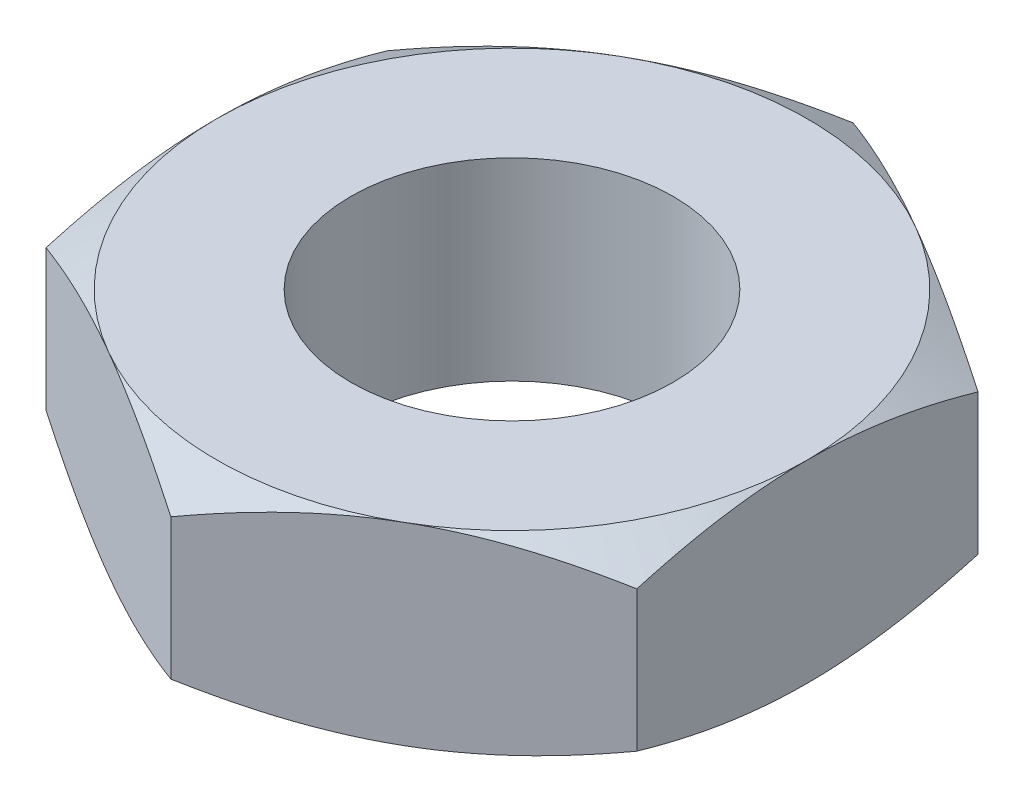
ISO-10303-21;
HEADER;
FILE_DESCRIPTION(('STEP AP214'),'2;1');
FILE_NAME('part.step','',(''),(''),'','','');
FILE_SCHEMA(('AUTOMOTIVE_DESIGN { 1 0 10303 214 1 1 1 1 }'));
ENDSEC;
DATA;
#1=APPLICATION_CONTEXT('core data for automotive mechanical design processes');
#2=APPLICATION_PROTOCOL_DEFINITION('international standard','automotive_design',2000,#1);
#3=PRODUCT_CONTEXT('',#1,'mechanical');
#4=PRODUCT('Part','Part','',(#3));
#5=PRODUCT_RELATED_PRODUCT_CATEGORY('part','',(#4));
#6=PRODUCT_DEFINITION_FORMATION('','',#4);
#7=PRODUCT_DEFINITION_CONTEXT('part definition',#1,'design');
#8=PRODUCT_DEFINITION('design','',#6,#7);
#9=PRODUCT_DEFINITION_SHAPE('','',#8);
#10=(LENGTH_UNIT() NAMED_UNIT(*) SI_UNIT(.MILLI.,.METRE.));
#11=(NAMED_UNIT(*) PLANE_ANGLE_UNIT() SI_UNIT($,.RADIAN.));
#12=(NAMED_UNIT(*) SI_UNIT($,.STERADIAN.) SOLID_ANGLE_UNIT());
#13=UNCERTAINTY_MEASURE_WITH_UNIT(LENGTH_MEASURE(1.E-05),#10,'distance_accuracy_value','');
#14=(GEOMETRIC_REPRESENTATION_CONTEXT(3) GLOBAL_UNCERTAINTY_ASSIGNED_CONTEXT((#13)) GLOBAL_UNIT_ASSIGNED_CONTEXT((#10,
#11,#12)) REPRESENTATION_CONTEXT('',''));
#15=CARTESIAN_POINT('',(0.,0.,0.));
#16=DIRECTION('',(0.,0.,1.));
#17=DIRECTION('',(1.,0.,0.));
#18=AXIS2_PLACEMENT_3D('',#15,#16,#17);
#19=CARTESIAN_POINT('',(-2.75,0.9,-1.58771324027147));
#20=DIRECTION('',(0.,1.,0.));
#21=DIRECTION('',(0.,0.,1.));
#22=AXIS2_PLACEMENT_3D('',#19,#20,#21);
#23=PLANE('',#22);
#24=CARTESIAN_POINT('',(0.,0.9,0.));
#25=DIRECTION('',(0.,1.,0.));
#26=DIRECTION('',(0.,0.,1.));
#27=AXIS2_PLACEMENT_3D('',#24,#25,#26);
#28=CIRCLE('',#27,1.5);
#29=CARTESIAN_POINT('',(0.,0.9,1.5));
#30=VERTEX_POINT('',#29);
#31=EDGE_CURVE('E233',#30,#30,#28,.T.);
#32=ORIENTED_EDGE('',*,*,#31,.F.);
#33=EDGE_LOOP('',(#32));
#34=FACE_BOUND('',#33,.T.);
#35=CARTESIAN_POINT('',(0.,0.9,0.));
#36=DIRECTION('',(0.,1.,0.));
#37=DIRECTION('',(0.,0.,1.));
#38=AXIS2_PLACEMENT_3D('',#35,#36,#37);
#39=CIRCLE('',#38,2.75);
#40=CARTESIAN_POINT('',(-1.375,0.9,2.38156986040721));
#41=VERTEX_POINT('',#40);
#42=CARTESIAN_POINT('',(1.375,0.9,2.3815698604072));
#43=VERTEX_POINT('',#42);
#44=EDGE_CURVE('E288',#41,#43,#39,.T.);
#45=ORIENTED_EDGE('',*,*,#44,.T.);
#46=CARTESIAN_POINT('',(2.75,0.9,0.));
#47=VERTEX_POINT('',#46);
#48=EDGE_CURVE('E291',#43,#47,#39,.T.);
#49=ORIENTED_EDGE('',*,*,#48,.T.);
#50=CARTESIAN_POINT('',(1.375,0.9,-2.38156986040721));
#51=VERTEX_POINT('',#50);
#52=EDGE_CURVE('E298',#47,#51,#39,.T.);
#53=ORIENTED_EDGE('',*,*,#52,.T.);
#54=CARTESIAN_POINT('',(-1.375,0.9,-2.38156986040721));
#55=VERTEX_POINT('',#54);
#56=EDGE_CURVE('E302',#51,#55,#39,.T.);
#57=ORIENTED_EDGE('',*,*,#56,.T.);
#58=CARTESIAN_POINT('',(-2.75,0.9,0.));
#59=VERTEX_POINT('',#58);
#60=EDGE_CURVE('E295',#55,#59,#39,.T.);
#61=ORIENTED_EDGE('',*,*,#60,.T.);
#62=EDGE_CURVE('E290',#59,#41,#39,.T.);
#63=ORIENTED_EDGE('',*,*,#62,.T.);
#64=EDGE_LOOP('',(#45,#49,#53,#57,#61,#63));
#65=FACE_BOUND('',#64,.T.);
#66=ADVANCED_FACE('F35',(#34,#65),#23,.T.);
#67=CARTESIAN_POINT('',(0.,0.9,-3.17542648054294));
#68=DIRECTION('',(0.5,0.,0.866025403784439));
#69=DIRECTION('',(0.866025403784439,0.,-0.5));
#70=AXIS2_PLACEMENT_3D('',#67,#68,#69);
#71=PLANE('',#70);
#72=DIRECTION('',(0.,-1.,0.));
#73=VECTOR('',#72,1.);
#74=CARTESIAN_POINT('',(0.,0.9,-3.17542648054294));
#75=LINE('',#74,#73);
#76=CARTESIAN_POINT('',(0.,0.654379906938139,-3.17542648054294));
#77=VERTEX_POINT('',#76);
#78=CARTESIAN_POINT('',(0.,-0.654379906938139,-3.17542648054294));
#79=VERTEX_POINT('',#78);
#80=EDGE_CURVE('E230',#77,#79,#75,.T.);
#81=ORIENTED_EDGE('',*,*,#80,.T.);
#82=CARTESIAN_POINT('',(0.000199999999999998,-0.654313236635241,-3.17554195059678));
#83=CARTESIAN_POINT('',(-0.120649220659906,-0.694612337750738,-3.10576962051743));
#84=CARTESIAN_POINT('',(-0.242541602622634,-0.731263097402339,-3.03539502097908));
#85=CARTESIAN_POINT('',(-0.488437126727893,-0.7952378170302,-2.89342717394439));
#86=CARTESIAN_POINT('',(-0.612444638573855,-0.822539144325503,-2.82183140359858));
#87=CARTESIAN_POINT('',(-0.858922797975944,-0.865038254705884,-2.67952717191842));
#88=CARTESIAN_POINT('',(-0.981355518587417,-0.880518881377543,-2.60884060771577));
#89=CARTESIAN_POINT('',(-1.22679714236892,-0.89900060263006,-2.46713482015518));
#90=CARTESIAN_POINT('',(-1.34980515323291,-0.902017000537401,-2.39611611197038));
#91=CARTESIAN_POINT('',(-1.57965878661079,-0.895746854571454,-2.26341005486544));
#92=CARTESIAN_POINT('',(-1.68653879125402,-0.887999845723298,-2.20170285541369));
#93=CARTESIAN_POINT('',(-1.89960246733475,-0.863444818935646,-2.07869048467395));
#94=CARTESIAN_POINT('',(-2.00578540164889,-0.84662841034943,-2.01738573896433));
#95=CARTESIAN_POINT('',(-2.21928848939318,-0.804588077654045,-1.89411967378235));
#96=CARTESIAN_POINT('',(-2.32658161614285,-0.77918591931277,-1.83217395817123));
#97=CARTESIAN_POINT('',(-2.53956747928405,-0.721532774160019,-1.70920651275307));
#98=CARTESIAN_POINT('',(-2.64526294502665,-0.689295336701019,-1.64818320715446));
#99=CARTESIAN_POINT('',(-2.7502,-0.654313236635241,-1.58759777021763));
#100=B_SPLINE_CURVE_WITH_KNOTS('',3,(#82,#83,#84,#85,#86,#87,#88,#89,#90,#91,#92,#93,#94,#95,
#96,#97,#98,#99),.UNSPECIFIED.,.F.,.F.,(4,2,2,2,2,2,2,2,4),(0.,0.435912828725888,
0.872873557116332,1.29901931904672,1.72464171213574,2.09526089052938,2.46622354066374,
2.84541551798557,3.22386274754524),.UNSPECIFIED.);
#101=CARTESIAN_POINT('',(-1.375,-0.9,-2.38156986040721));
#102=VERTEX_POINT('',#101);
#103=EDGE_CURVE('E58',#79,#102,#100,.T.);
#104=ORIENTED_EDGE('',*,*,#103,.T.);
#105=CARTESIAN_POINT('',(-2.75,-0.654379906938285,-1.58771324027169));
#106=VERTEX_POINT('',#105);
#107=EDGE_CURVE('E191',#102,#106,#100,.T.);
#108=ORIENTED_EDGE('',*,*,#107,.T.);
#109=DIRECTION('',(0.,-1.,0.));
#110=VECTOR('',#109,1.);
#111=CARTESIAN_POINT('',(-2.75,0.9,-1.58771324027147));
#112=LINE('',#111,#110);
#113=CARTESIAN_POINT('',(-2.75,0.654379906938285,-1.58771324027169));
#114=VERTEX_POINT('',#113);
#115=EDGE_CURVE('E218',#114,#106,#112,.T.);
#116=ORIENTED_EDGE('',*,*,#115,.F.);
#117=CARTESIAN_POINT('',(0.000199999999999998,0.654313236635241,-3.17554195059678));
#118=CARTESIAN_POINT('',(-0.120649220659906,0.694612337750738,-3.10576962051743));
#119=CARTESIAN_POINT('',(-0.242541602622634,0.731263097402339,-3.03539502097908));
#120=CARTESIAN_POINT('',(-0.488437126727893,0.7952378170302,-2.89342717394439));
#121=CARTESIAN_POINT('',(-0.612444638573855,0.822539144325503,-2.82183140359858));
#122=CARTESIAN_POINT('',(-0.858922797975944,0.865038254705884,-2.67952717191842));
#123=CARTESIAN_POINT('',(-0.981355518587417,0.880518881377543,-2.60884060771577));
#124=CARTESIAN_POINT('',(-1.22679714236892,0.89900060263006,-2.46713482015518));
#125=CARTESIAN_POINT('',(-1.34980515323291,0.902017000537401,-2.39611611197038));
#126=CARTESIAN_POINT('',(-1.57965878661079,0.895746854571454,-2.26341005486544));
#127=CARTESIAN_POINT('',(-1.68653879125402,0.887999845723298,-2.20170285541369));
#128=CARTESIAN_POINT('',(-1.89960246733475,0.863444818935646,-2.07869048467395));
#129=CARTESIAN_POINT('',(-2.00578540164889,0.84662841034943,-2.01738573896433));
#130=CARTESIAN_POINT('',(-2.21928848939318,0.804588077654045,-1.89411967378235));
#131=CARTESIAN_POINT('',(-2.32658161614285,0.77918591931277,-1.83217395817123));
#132=CARTESIAN_POINT('',(-2.53956747928405,0.721532774160019,-1.70920651275307));
#133=CARTESIAN_POINT('',(-2.64526294502665,0.689295336701019,-1.64818320715446));
#134=CARTESIAN_POINT('',(-2.7502,0.654313236635241,-1.58759777021763));
#135=B_SPLINE_CURVE_WITH_KNOTS('',3,(#117,#118,#119,#120,#121,#122,#123,#124,#125,#126,#127,
#128,#129,#130,#131,#132,#133,#134),.UNSPECIFIED.,.F.,.F.,(4,2,2,2,2,2,2,2,4),(0.,
0.435912828725888,0.872873557116332,1.29901931904672,1.72464171213574,2.09526089052938,
2.46622354066374,2.84541551798557,3.22386274754524),.UNSPECIFIED.);
#136=EDGE_CURVE('E240',#55,#114,#135,.T.);
#137=ORIENTED_EDGE('',*,*,#136,.F.);
#138=EDGE_CURVE('E237',#77,#55,#135,.T.);
#139=ORIENTED_EDGE('',*,*,#138,.F.);
#140=EDGE_LOOP('',(#81,#104,#108,#116,#137,#139));
#141=FACE_BOUND('',#140,.T.);
#142=ADVANCED_FACE('F37',(#141),#71,.F.);
#143=CARTESIAN_POINT('',(-2.75,0.9,-1.58771324027147));
#144=DIRECTION('',(1.,0.,0.));
#145=DIRECTION('',(0.,0.,-1.));
#146=AXIS2_PLACEMENT_3D('',#143,#144,#145);
#147=PLANE('',#146);
#148=ORIENTED_EDGE('',*,*,#115,.T.);
#149=CARTESIAN_POINT('',(-2.75,0.460292801968697,-4.30229228147667));
#150=CARTESIAN_POINT('',(-2.75,0.401715698769004,-4.18184588321156));
#151=CARTESIAN_POINT('',(-2.75,0.343689570601256,-4.06112695427671));
#152=CARTESIAN_POINT('',(-2.75,0.229048462854545,-3.81899921535963));
#153=CARTESIAN_POINT('',(-2.75,0.172433698649216,-3.69759030351562));
#154=CARTESIAN_POINT('',(-2.75,0.0606477565982202,-3.4533302493796));
#155=CARTESIAN_POINT('',(-2.75,0.00548579337230973,-3.33047487569264));
#156=CARTESIAN_POINT('',(-2.75,-0.10262979006472,-3.08379982818744));
#157=CARTESIAN_POINT('',(-2.75,-0.155583512232009,-2.95998019920355));
#158=CARTESIAN_POINT('',(-2.75,-0.26040203140135,-2.7070748972286));
#159=CARTESIAN_POINT('',(-2.75,-0.312173286945629,-2.57795024654349));
#160=CARTESIAN_POINT('',(-2.75,-0.411887571928489,-2.3182042596449));
#161=CARTESIAN_POINT('',(-2.75,-0.459830177176171,-2.18758275941794));
#162=CARTESIAN_POINT('',(-2.75,-0.550656251359419,-1.92486771315457));
#163=CARTESIAN_POINT('',(-2.75,-0.593549636883523,-1.79277762963402));
#164=CARTESIAN_POINT('',(-2.75,-0.67292585979378,-1.5267030839741));
#165=CARTESIAN_POINT('',(-2.75,-0.709410676239576,-1.39271922052041));
#166=CARTESIAN_POINT('',(-2.75,-0.774051978112354,-1.12351502376349));
#167=CARTESIAN_POINT('',(-2.75,-0.802253962773325,-0.988305818065019));
#168=CARTESIAN_POINT('',(-2.75,-0.848756307085882,-0.716167543492841));
#169=CARTESIAN_POINT('',(-2.75,-0.867057700372022,-0.579238655684047));
#170=CARTESIAN_POINT('',(-2.75,-0.89206096141632,-0.306149321740134));
#171=CARTESIAN_POINT('',(-2.75,-0.898914934605899,-0.17000315446768));
#172=CARTESIAN_POINT('',(-2.75,-0.900845103918733,0.102386201711707));
#173=CARTESIAN_POINT('',(-2.75,-0.895921067219212,0.238629392483338));
#174=CARTESIAN_POINT('',(-2.75,-0.878005096328899,0.468799581618867));
#175=CARTESIAN_POINT('',(-2.75,-0.867929416421033,0.562968248554006));
#176=CARTESIAN_POINT('',(-2.75,-0.842758272239521,0.750636766805154));
#177=CARTESIAN_POINT('',(-2.75,-0.827662158780661,0.844136530028113));
#178=CARTESIAN_POINT('',(-2.75,-0.775634520462128,1.12349388265861));
#179=CARTESIAN_POINT('',(-2.75,-0.731972226995504,1.30811301992888));
#180=CARTESIAN_POINT('',(-2.75,-0.655985008360692,1.58428098783429));
#181=CARTESIAN_POINT('',(-2.75,-0.628535830793461,1.6772530181262));
#182=CARTESIAN_POINT('',(-2.75,-0.570719976824478,1.86229424858384));
#183=CARTESIAN_POINT('',(-2.75,-0.540353278769842,1.95436344204342));
#184=CARTESIAN_POINT('',(-2.75,-0.477195289852816,2.13762784914898));
#185=CARTESIAN_POINT('',(-2.75,-0.444404727800364,2.22882331626663));
#186=CARTESIAN_POINT('',(-2.75,-0.37679149018024,2.41045326785417));
#187=CARTESIAN_POINT('',(-2.75,-0.341968855720013,2.5008877676756));
#188=CARTESIAN_POINT('',(-2.75,-0.248080054227535,2.73803868889508));
#189=CARTESIAN_POINT('',(-2.75,-0.187603508593744,2.88419612668514));
#190=CARTESIAN_POINT('',(-2.75,-0.0632546405263525,3.17506436878796));
#191=CARTESIAN_POINT('',(-2.75,0.000618015250890259,3.31977502943065));
#192=CARTESIAN_POINT('',(-2.75,0.130975986203147,3.60806551523662));
#193=CARTESIAN_POINT('',(-2.75,0.197462111256228,3.75164497304352));
#194=CARTESIAN_POINT('',(-2.75,0.332451238107801,4.03785436433045));
#195=CARTESIAN_POINT('',(-2.75,0.400954297186409,4.18048427070228));
#196=CARTESIAN_POINT('',(-2.75,0.609019028849832,4.60763641251465));
#197=CARTESIAN_POINT('',(-2.75,0.750945116080421,4.89100559224824));
#198=CARTESIAN_POINT('',(-2.75,1.03880084166866,5.45562064142955));
#199=CARTESIAN_POINT('',(-2.75,1.18472972560453,5.73686689842236));
#200=CARTESIAN_POINT('',(-2.75,1.46444275775998,6.26953449084933));
#201=CARTESIAN_POINT('',(-2.75,1.59796226335303,6.5210950380334));
#202=CARTESIAN_POINT('',(-2.75,1.8666383903487,7.02335674412299));
#203=CARTESIAN_POINT('',(-2.75,2.00179510165774,7.27405785485413));
#204=CARTESIAN_POINT('',(-2.75,2.27290177486606,7.77401000381799));
#205=CARTESIAN_POINT('',(-2.75,2.40884790427718,8.02326312277004));
#206=CARTESIAN_POINT('',(-2.75,2.68167969506653,8.5212312678429));
#207=CARTESIAN_POINT('',(-2.75,2.8185652873858,8.76994633178476));
#208=CARTESIAN_POINT('',(-2.75,2.95579397189845,9.01847061905945));
#209=B_SPLINE_CURVE_WITH_KNOTS('',3,(#149,#150,#151,#152,#153,#154,#155,#156,#157,#158,#159,
#160,#161,#162,#163,#164,#165,#166,#167,#168,#169,#170,#171,#172,#173,#174,#175,#176,#177,#178,
#179,#180,#181,#182,#183,#184,#185,#186,#187,#188,#189,#190,#191,#192,#193,#194,#195,#196,#197,
#198,#199,#200,#201,#202,#203,#204,#205,#206,#207,#208),.UNSPECIFIED.,.F.,.F.,(4,2,2,2,2,2,2,2,
2,2,2,2,2,2,2,2,2,2,2,2,2,2,2,2,2,2,2,2,2,4),(0.,0.401810043563882,0.803681032443233,
1.20767668606413,1.61165366619977,2.0289566266266,2.44630575769423,2.8628210405234,
3.27920747034625,3.69326188673398,4.10727306695812,4.51573806307525,4.92421113362441,
5.20819264013989,5.49221088219265,6.06053671535663,6.35132938133471,6.64212420564753,
6.93283194637515,7.22353380831987,7.69799655406946,8.17250595677581,8.64716358088236,
9.12183469810138,10.0725485843152,11.0230845007839,11.8774716760369,12.7319059842119,
13.5836526407181,14.4353373428422),.UNSPECIFIED.);
#210=CARTESIAN_POINT('',(-2.75,-0.9,0.));
#211=VERTEX_POINT('',#210);
#212=EDGE_CURVE('E269',#106,#211,#209,.T.);
#213=ORIENTED_EDGE('',*,*,#212,.T.);
#214=CARTESIAN_POINT('',(-2.75,-0.654379906938139,1.58771324027147));
#215=VERTEX_POINT('',#214);
#216=EDGE_CURVE('E264',#211,#215,#209,.T.);
#217=ORIENTED_EDGE('',*,*,#216,.T.);
#218=DIRECTION('',(0.,-1.,0.));
#219=VECTOR('',#218,1.);
#220=CARTESIAN_POINT('',(-2.75,0.9,1.58771324027147));
#221=LINE('',#220,#219);
#222=CARTESIAN_POINT('',(-2.75,0.654379906938139,1.58771324027147));
#223=VERTEX_POINT('',#222);
#224=EDGE_CURVE('E221',#223,#215,#221,.T.);
#225=ORIENTED_EDGE('',*,*,#224,.F.);
#226=CARTESIAN_POINT('',(-2.75,-0.460292801968697,-4.30229228147667));
#227=CARTESIAN_POINT('',(-2.75,-0.401715698769004,-4.18184588321156));
#228=CARTESIAN_POINT('',(-2.75,-0.343689570601256,-4.06112695427671));
#229=CARTESIAN_POINT('',(-2.75,-0.229048462854545,-3.81899921535963));
#230=CARTESIAN_POINT('',(-2.75,-0.172433698649216,-3.69759030351562));
#231=CARTESIAN_POINT('',(-2.75,-0.0606477565982202,-3.4533302493796));
#232=CARTESIAN_POINT('',(-2.75,-0.00548579337230973,-3.33047487569264));
#233=CARTESIAN_POINT('',(-2.75,0.10262979006472,-3.08379982818744));
#234=CARTESIAN_POINT('',(-2.75,0.155583512232009,-2.95998019920355));
#235=CARTESIAN_POINT('',(-2.75,0.26040203140135,-2.7070748972286));
#236=CARTESIAN_POINT('',(-2.75,0.312173286945629,-2.57795024654349));
#237=CARTESIAN_POINT('',(-2.75,0.411887571928489,-2.3182042596449));
#238=CARTESIAN_POINT('',(-2.75,0.459830177176171,-2.18758275941794));
#239=CARTESIAN_POINT('',(-2.75,0.550656251359419,-1.92486771315457));
#240=CARTESIAN_POINT('',(-2.75,0.593549636883523,-1.79277762963402));
#241=CARTESIAN_POINT('',(-2.75,0.67292585979378,-1.5267030839741));
#242=CARTESIAN_POINT('',(-2.75,0.709410676239576,-1.39271922052041));
#243=CARTESIAN_POINT('',(-2.75,0.774051978112354,-1.12351502376349));
#244=CARTESIAN_POINT('',(-2.75,0.802253962773325,-0.988305818065019));
#245=CARTESIAN_POINT('',(-2.75,0.848756307085882,-0.716167543492841));
#246=CARTESIAN_POINT('',(-2.75,0.867057700372022,-0.579238655684047));
#247=CARTESIAN_POINT('',(-2.75,0.89206096141632,-0.306149321740134));
#248=CARTESIAN_POINT('',(-2.75,0.898914934605899,-0.17000315446768));
#249=CARTESIAN_POINT('',(-2.75,0.900845103918733,0.102386201711707));
#250=CARTESIAN_POINT('',(-2.75,0.895921067219212,0.238629392483338));
#251=CARTESIAN_POINT('',(-2.75,0.878005096328899,0.468799581618867));
#252=CARTESIAN_POINT('',(-2.75,0.867929416421033,0.562968248554006));
#253=CARTESIAN_POINT('',(-2.75,0.842758272239521,0.750636766805154));
#254=CARTESIAN_POINT('',(-2.75,0.827662158780661,0.844136530028113));
#255=CARTESIAN_POINT('',(-2.75,0.775634520462128,1.12349388265861));
#256=CARTESIAN_POINT('',(-2.75,0.731972226995504,1.30811301992888));
#257=CARTESIAN_POINT('',(-2.75,0.655985008360692,1.58428098783429));
#258=CARTESIAN_POINT('',(-2.75,0.628535830793461,1.6772530181262));
#259=CARTESIAN_POINT('',(-2.75,0.570719976824478,1.86229424858384));
#260=CARTESIAN_POINT('',(-2.75,0.540353278769842,1.95436344204342));
#261=CARTESIAN_POINT('',(-2.75,0.477195289852816,2.13762784914898));
#262=CARTESIAN_POINT('',(-2.75,0.444404727800364,2.22882331626663));
#263=CARTESIAN_POINT('',(-2.75,0.37679149018024,2.41045326785417));
#264=CARTESIAN_POINT('',(-2.75,0.341968855720013,2.5008877676756));
#265=CARTESIAN_POINT('',(-2.75,0.248080054227535,2.73803868889508));
#266=CARTESIAN_POINT('',(-2.75,0.187603508593744,2.88419612668514));
#267=CARTESIAN_POINT('',(-2.75,0.0632546405263525,3.17506436878796));
#268=CARTESIAN_POINT('',(-2.75,-0.000618015250890259,3.31977502943065));
#269=CARTESIAN_POINT('',(-2.75,-0.130975986203147,3.60806551523662));
#270=CARTESIAN_POINT('',(-2.75,-0.197462111256228,3.75164497304352));
#271=CARTESIAN_POINT('',(-2.75,-0.332451238107801,4.03785436433045));
#272=CARTESIAN_POINT('',(-2.75,-0.400954297186409,4.18048427070228));
#273=CARTESIAN_POINT('',(-2.75,-0.609019028849832,4.60763641251465));
#274=CARTESIAN_POINT('',(-2.75,-0.750945116080421,4.89100559224824));
#275=CARTESIAN_POINT('',(-2.75,-1.03880084166866,5.45562064142955));
#276=CARTESIAN_POINT('',(-2.75,-1.18472972560453,5.73686689842236));
#277=CARTESIAN_POINT('',(-2.75,-1.46444275775998,6.26953449084933));
#278=CARTESIAN_POINT('',(-2.75,-1.59796226335303,6.5210950380334));
#279=CARTESIAN_POINT('',(-2.75,-1.8666383903487,7.02335674412299));
#280=CARTESIAN_POINT('',(-2.75,-2.00179510165774,7.27405785485413));
#281=CARTESIAN_POINT('',(-2.75,-2.27290177486606,7.77401000381799));
#282=CARTESIAN_POINT('',(-2.75,-2.40884790427718,8.02326312277004));
#283=CARTESIAN_POINT('',(-2.75,-2.68167969506653,8.5212312678429));
#284=CARTESIAN_POINT('',(-2.75,-2.8185652873858,8.76994633178476));
#285=CARTESIAN_POINT('',(-2.75,-2.95579397189845,9.01847061905945));
#286=B_SPLINE_CURVE_WITH_KNOTS('',3,(#226,#227,#228,#229,#230,#231,#232,#233,#234,#235,#236,
#237,#238,#239,#240,#241,#242,#243,#244,#245,#246,#247,#248,#249,#250,#251,#252,#253,#254,#255,
#256,#257,#258,#259,#260,#261,#262,#263,#264,#265,#266,#267,#268,#269,#270,#271,#272,#273,#274,
#275,#276,#277,#278,#279,#280,#281,#282,#283,#284,#285),.UNSPECIFIED.,.F.,.F.,(4,2,2,2,2,2,2,2,
2,2,2,2,2,2,2,2,2,2,2,2,2,2,2,2,2,2,2,2,2,4),(0.,0.401810043563882,0.803681032443233,
1.20767668606413,1.61165366619977,2.0289566266266,2.44630575769423,2.8628210405234,
3.27920747034625,3.69326188673398,4.10727306695812,4.51573806307525,4.92421113362441,
5.20819264013989,5.49221088219265,6.06053671535663,6.35132938133471,6.64212420564753,
6.93283194637515,7.22353380831987,7.69799655406946,8.17250595677581,8.64716358088236,
9.12183469810138,10.0725485843152,11.0230845007839,11.8774716760369,12.7319059842119,
13.5836526407181,14.4353373428422),.UNSPECIFIED.);
#287=EDGE_CURVE('E246',#59,#223,#286,.T.);
#288=ORIENTED_EDGE('',*,*,#287,.F.);
#289=EDGE_CURVE('E245',#114,#59,#286,.T.);
#290=ORIENTED_EDGE('',*,*,#289,.F.);
#291=EDGE_LOOP('',(#148,#213,#217,#225,#288,#290));
#292=FACE_BOUND('',#291,.T.);
#293=ADVANCED_FACE('F257',(#292),#147,.F.);
#294=CARTESIAN_POINT('',(-2.75,0.9,1.58771324027147));
#295=DIRECTION('',(0.5,0.,-0.866025403784438));
#296=DIRECTION('',(-0.866025403784439,0.,-0.5));
#297=AXIS2_PLACEMENT_3D('',#294,#295,#296);
#298=PLANE('',#297);
#299=ORIENTED_EDGE('',*,*,#224,.T.);
#300=CARTESIAN_POINT('',(-2.7502,-0.654313236635241,1.58759777021763));
#301=CARTESIAN_POINT('',(-2.62935077934009,-0.694612337750738,1.65737010029699));
#302=CARTESIAN_POINT('',(-2.50745839737737,-0.731263097402339,1.72774469983533));
#303=CARTESIAN_POINT('',(-2.26156287327211,-0.7952378170302,1.86971254687003));
#304=CARTESIAN_POINT('',(-2.13755536142614,-0.822539144325503,1.94130831721583));
#305=CARTESIAN_POINT('',(-1.89107720202406,-0.865038254705884,2.08361254889599));
#306=CARTESIAN_POINT('',(-1.76864448141258,-0.880518881377543,2.15429911309864));
#307=CARTESIAN_POINT('',(-1.52320285763108,-0.89900060263006,2.29600490065923));
#308=CARTESIAN_POINT('',(-1.40019484676709,-0.902017000537401,2.36702360884404));
#309=CARTESIAN_POINT('',(-1.17034121338921,-0.895746854571454,2.49972966594897));
#310=CARTESIAN_POINT('',(-1.06346120874598,-0.887999845723298,2.56143686540073));
#311=CARTESIAN_POINT('',(-0.850397532665251,-0.863444818935646,2.68444923614046));
#312=CARTESIAN_POINT('',(-0.744214598351111,-0.84662841034943,2.74575398185008));
#313=CARTESIAN_POINT('',(-0.530711510606817,-0.804588077654045,2.86902004703206));
#314=CARTESIAN_POINT('',(-0.423418383857146,-0.77918591931277,2.93096576264318));
#315=CARTESIAN_POINT('',(-0.210432520715949,-0.721532774160019,3.05393320806134));
#316=CARTESIAN_POINT('',(-0.104737054973348,-0.689295336701019,3.11495651365995));
#317=CARTESIAN_POINT('',(0.000199999999999512,-0.654313236635241,3.17554195059678));
#318=B_SPLINE_CURVE_WITH_KNOTS('',3,(#300,#301,#302,#303,#304,#305,#306,#307,#308,#309,#310,
#311,#312,#313,#314,#315,#316,#317),.UNSPECIFIED.,.F.,.F.,(4,2,2,2,2,2,2,2,4),(0.,
0.435912828725888,0.872873557116332,1.29901931904672,1.72464171213574,2.09526089052938,
2.46622354066374,2.84541551798557,3.22386274754524),.UNSPECIFIED.);
#319=CARTESIAN_POINT('',(-1.375,-0.9,2.38156986040721));
#320=VERTEX_POINT('',#319);
#321=EDGE_CURVE('E159',#215,#320,#318,.T.);
#322=ORIENTED_EDGE('',*,*,#321,.T.);
#323=CARTESIAN_POINT('',(0.,-0.654379906938139,3.17542648054294));
#324=VERTEX_POINT('',#323);
#325=EDGE_CURVE('E143',#320,#324,#318,.T.);
#326=ORIENTED_EDGE('',*,*,#325,.T.);
#327=DIRECTION('',(0.,-1.,0.));
#328=VECTOR('',#327,1.);
#329=CARTESIAN_POINT('',(0.,0.9,3.17542648054294));
#330=LINE('',#329,#328);
#331=CARTESIAN_POINT('',(0.,0.654379906938139,3.17542648054294));
#332=VERTEX_POINT('',#331);
#333=EDGE_CURVE('E158',#332,#324,#330,.T.);
#334=ORIENTED_EDGE('',*,*,#333,.F.);
#335=CARTESIAN_POINT('',(-2.7502,0.654313236635241,1.58759777021763));
#336=CARTESIAN_POINT('',(-2.62935077934009,0.694612337750738,1.65737010029699));
#337=CARTESIAN_POINT('',(-2.50745839737737,0.731263097402339,1.72774469983533));
#338=CARTESIAN_POINT('',(-2.26156287327211,0.7952378170302,1.86971254687003));
#339=CARTESIAN_POINT('',(-2.13755536142614,0.822539144325503,1.94130831721583));
#340=CARTESIAN_POINT('',(-1.89107720202406,0.865038254705884,2.08361254889599));
#341=CARTESIAN_POINT('',(-1.76864448141258,0.880518881377543,2.15429911309864));
#342=CARTESIAN_POINT('',(-1.52320285763108,0.89900060263006,2.29600490065923));
#343=CARTESIAN_POINT('',(-1.40019484676709,0.902017000537401,2.36702360884404));
#344=CARTESIAN_POINT('',(-1.17034121338921,0.895746854571454,2.49972966594897));
#345=CARTESIAN_POINT('',(-1.06346120874598,0.887999845723298,2.56143686540073));
#346=CARTESIAN_POINT('',(-0.850397532665251,0.863444818935646,2.68444923614046));
#347=CARTESIAN_POINT('',(-0.744214598351111,0.84662841034943,2.74575398185008));
#348=CARTESIAN_POINT('',(-0.530711510606817,0.804588077654045,2.86902004703206));
#349=CARTESIAN_POINT('',(-0.423418383857146,0.77918591931277,2.93096576264318));
#350=CARTESIAN_POINT('',(-0.210432520715949,0.721532774160019,3.05393320806134));
#351=CARTESIAN_POINT('',(-0.104737054973348,0.689295336701019,3.11495651365995));
#352=CARTESIAN_POINT('',(0.000199999999999512,0.654313236635241,3.17554195059678));
#353=B_SPLINE_CURVE_WITH_KNOTS('',3,(#335,#336,#337,#338,#339,#340,#341,#342,#343,#344,#345,
#346,#347,#348,#349,#350,#351,#352),.UNSPECIFIED.,.F.,.F.,(4,2,2,2,2,2,2,2,4),(0.,
0.435912828725888,0.872873557116332,1.29901931904672,1.72464171213574,2.09526089052938,
2.46622354066374,2.84541551798557,3.22386274754524),.UNSPECIFIED.);
#354=EDGE_CURVE('E252',#41,#332,#353,.T.);
#355=ORIENTED_EDGE('',*,*,#354,.F.);
#356=EDGE_CURVE('E251',#223,#41,#353,.T.);
#357=ORIENTED_EDGE('',*,*,#356,.F.);
#358=EDGE_LOOP('',(#299,#322,#326,#334,#355,#357));
#359=FACE_BOUND('',#358,.T.);
#360=ADVANCED_FACE('F260',(#359),#298,.F.);
#361=CARTESIAN_POINT('',(0.,0.9,3.17542648054294));
#362=DIRECTION('',(-0.5,0.,-0.866025403784438));
#363=DIRECTION('',(-0.866025403784439,0.,0.5));
#364=AXIS2_PLACEMENT_3D('',#361,#362,#363);
#365=PLANE('',#364);
#366=ORIENTED_EDGE('',*,*,#333,.T.);
#367=CARTESIAN_POINT('',(-0.000200000000000636,-0.654313236635241,3.17554195059678));
#368=CARTESIAN_POINT('',(0.120649220659906,-0.694612337750738,3.10576962051743));
#369=CARTESIAN_POINT('',(0.242541602622633,-0.731263097402339,3.03539502097908));
#370=CARTESIAN_POINT('',(0.488437126727892,-0.7952378170302,2.89342717394438));
#371=CARTESIAN_POINT('',(0.612444638573855,-0.822539144325504,2.82183140359858));
#372=CARTESIAN_POINT('',(0.858922797975943,-0.865038254705884,2.67952717191842));
#373=CARTESIAN_POINT('',(0.981355518587416,-0.880518881377543,2.60884060771577));
#374=CARTESIAN_POINT('',(1.22679714236891,-0.899000602630061,2.46713482015518));
#375=CARTESIAN_POINT('',(1.34980515323291,-0.902017000537402,2.39611611197037));
#376=CARTESIAN_POINT('',(1.57965878661079,-0.895746854571455,2.26341005486544));
#377=CARTESIAN_POINT('',(1.68653879125402,-0.887999845723299,2.20170285541368));
#378=CARTESIAN_POINT('',(1.89960246733475,-0.863444818935647,2.07869048467395));
#379=CARTESIAN_POINT('',(2.00578540164889,-0.846628410349431,2.01738573896433));
#380=CARTESIAN_POINT('',(2.21928848939318,-0.804588077654045,1.89411967378235));
#381=CARTESIAN_POINT('',(2.32658161614285,-0.779185919312771,1.83217395817123));
#382=CARTESIAN_POINT('',(2.53956747928405,-0.72153277416002,1.70920651275307));
#383=CARTESIAN_POINT('',(2.64526294502665,-0.68929533670102,1.64818320715446));
#384=CARTESIAN_POINT('',(2.7502,-0.654313236635242,1.58759777021763));
#385=B_SPLINE_CURVE_WITH_KNOTS('',3,(#367,#368,#369,#370,#371,#372,#373,#374,#375,#376,#377,
#378,#379,#380,#381,#382,#383,#384),.UNSPECIFIED.,.F.,.F.,(4,2,2,2,2,2,2,2,4),(0.,
0.435912828725888,0.872873557116332,1.29901931904672,1.72464171213574,2.09526089052938,
2.46622354066374,2.84541551798557,3.22386274754524),.UNSPECIFIED.);
#386=CARTESIAN_POINT('',(1.375,-0.9,2.38156986040721));
#387=VERTEX_POINT('',#386);
#388=EDGE_CURVE('E137',#324,#387,#385,.T.);
#389=ORIENTED_EDGE('',*,*,#388,.T.);
#390=CARTESIAN_POINT('',(2.75,-0.65437990693814,1.58771324027147));
#391=VERTEX_POINT('',#390);
#392=EDGE_CURVE('E125',#387,#391,#385,.T.);
#393=ORIENTED_EDGE('',*,*,#392,.T.);
#394=DIRECTION('',(0.,-1.,0.));
#395=VECTOR('',#394,1.);
#396=CARTESIAN_POINT('',(2.75,0.9,1.58771324027147));
#397=LINE('',#396,#395);
#398=CARTESIAN_POINT('',(2.75,0.65437990693814,1.58771324027147));
#399=VERTEX_POINT('',#398);
#400=EDGE_CURVE('E225',#399,#391,#397,.T.);
#401=ORIENTED_EDGE('',*,*,#400,.F.);
#402=CARTESIAN_POINT('',(-0.000200000000000636,0.654313236635241,3.17554195059678));
#403=CARTESIAN_POINT('',(0.120649220659906,0.694612337750738,3.10576962051743));
#404=CARTESIAN_POINT('',(0.242541602622633,0.731263097402339,3.03539502097908));
#405=CARTESIAN_POINT('',(0.488437126727892,0.7952378170302,2.89342717394438));
#406=CARTESIAN_POINT('',(0.612444638573855,0.822539144325504,2.82183140359858));
#407=CARTESIAN_POINT('',(0.858922797975943,0.865038254705884,2.67952717191842));
#408=CARTESIAN_POINT('',(0.981355518587416,0.880518881377543,2.60884060771577));
#409=CARTESIAN_POINT('',(1.22679714236891,0.899000602630061,2.46713482015518));
#410=CARTESIAN_POINT('',(1.34980515323291,0.902017000537402,2.39611611197037));
#411=CARTESIAN_POINT('',(1.57965878661079,0.895746854571455,2.26341005486544));
#412=CARTESIAN_POINT('',(1.68653879125402,0.887999845723299,2.20170285541368));
#413=CARTESIAN_POINT('',(1.89960246733475,0.863444818935647,2.07869048467395));
#414=CARTESIAN_POINT('',(2.00578540164889,0.846628410349431,2.01738573896433));
#415=CARTESIAN_POINT('',(2.21928848939318,0.804588077654045,1.89411967378235));
#416=CARTESIAN_POINT('',(2.32658161614285,0.779185919312771,1.83217395817123));
#417=CARTESIAN_POINT('',(2.53956747928405,0.72153277416002,1.70920651275307));
#418=CARTESIAN_POINT('',(2.64526294502665,0.68929533670102,1.64818320715446));
#419=CARTESIAN_POINT('',(2.7502,0.654313236635242,1.58759777021763));
#420=B_SPLINE_CURVE_WITH_KNOTS('',3,(#402,#403,#404,#405,#406,#407,#408,#409,#410,#411,#412,
#413,#414,#415,#416,#417,#418,#419),.UNSPECIFIED.,.F.,.F.,(4,2,2,2,2,2,2,2,4),(0.,
0.435912828725888,0.872873557116332,1.29901931904672,1.72464171213574,2.09526089052938,
2.46622354066374,2.84541551798557,3.22386274754524),.UNSPECIFIED.);
#421=EDGE_CURVE('E320',#43,#399,#420,.T.);
#422=ORIENTED_EDGE('',*,*,#421,.F.);
#423=EDGE_CURVE('E322',#332,#43,#420,.T.);
#424=ORIENTED_EDGE('',*,*,#423,.F.);
#425=EDGE_LOOP('',(#366,#389,#393,#401,#422,#424));
#426=FACE_BOUND('',#425,.T.);
#427=ADVANCED_FACE('F155',(#426),#365,.F.);
#428=CARTESIAN_POINT('',(2.75,0.9,1.58771324027147));
#429=DIRECTION('',(-1.,0.,0.));
#430=DIRECTION('',(0.,0.,1.));
#431=AXIS2_PLACEMENT_3D('',#428,#429,#430);
#432=PLANE('',#431);
#433=ORIENTED_EDGE('',*,*,#400,.T.);
#434=CARTESIAN_POINT('',(2.75,0.460292802381606,-4.30229228232547));
#435=CARTESIAN_POINT('',(2.75,0.401715699164673,-4.1818458840318));
#436=CARTESIAN_POINT('',(2.75,0.343689570979693,-4.06112695506836));
#437=CARTESIAN_POINT('',(2.75,0.229048463198604,-3.81899921609404));
#438=CARTESIAN_POINT('',(2.75,0.172433698976128,-3.69759030422136));
#439=CARTESIAN_POINT('',(2.75,0.0606477568908252,-3.45333025002757));
#440=CARTESIAN_POINT('',(2.75,0.0054857936477587,-3.33047487631149));
#441=CARTESIAN_POINT('',(2.75,-0.102629789823298,-3.08379982874787));
#442=CARTESIAN_POINT('',(2.75,-0.155583512007458,-2.95998019973468));
#443=CARTESIAN_POINT('',(2.75,-0.260402031211011,-2.70707489769887));
#444=CARTESIAN_POINT('',(2.75,-0.312173286772591,-2.57795024698219));
#445=CARTESIAN_POINT('',(2.75,-0.41188757178913,-2.31820426001997));
#446=CARTESIAN_POINT('',(2.75,-0.459830177053189,-2.18758275976092));
#447=CARTESIAN_POINT('',(2.75,-0.550656251267622,-1.92486771343281));
#448=CARTESIAN_POINT('',(2.75,-0.593549636806539,-1.79277762987959));
#449=CARTESIAN_POINT('',(2.75,-0.672925859744001,-1.52670308415344));
#450=CARTESIAN_POINT('',(2.75,-0.709410676202191,-1.3927192206662));
#451=CARTESIAN_POINT('',(2.75,-0.774051978099973,-1.1235150238249));
#452=CARTESIAN_POINT('',(2.75,-0.802253962772593,-0.988305818075371));
#453=CARTESIAN_POINT('',(2.75,-0.848756307100736,-0.716167543399858));
#454=CARTESIAN_POINT('',(2.75,-0.867057700390823,-0.579238655538784));
#455=CARTESIAN_POINT('',(2.75,-0.892060961433694,-0.306149321491176));
#456=CARTESIAN_POINT('',(2.75,-0.898914934618074,-0.170003154167318));
#457=CARTESIAN_POINT('',(2.75,-0.900845103911546,0.102386202114088));
#458=CARTESIAN_POINT('',(2.75,-0.895921067197859,0.238629392936334));
#459=CARTESIAN_POINT('',(2.75,-0.878005096278978,0.468799582135478));
#460=CARTESIAN_POINT('',(2.75,-0.867929416359779,0.56296824908419));
#461=CARTESIAN_POINT('',(2.75,-0.842758272154999,0.750636767361879));
#462=CARTESIAN_POINT('',(2.75,-0.827662158684203,0.844136530597806));
#463=CARTESIAN_POINT('',(2.75,-0.775634520329611,1.1234938832665));
#464=CARTESIAN_POINT('',(2.75,-0.731972226838627,1.30811302056124));
#465=CARTESIAN_POINT('',(2.75,-0.655985008167864,1.58428098850325));
#466=CARTESIAN_POINT('',(2.75,-0.628535830588567,1.67725301880762));
#467=CARTESIAN_POINT('',(2.75,-0.570719976595816,1.86229424929004));
#468=CARTESIAN_POINT('',(2.75,-0.54035327852948,1.95436344276194));
#469=CARTESIAN_POINT('',(2.75,-0.477195289589469,2.13762784989206));
#470=CARTESIAN_POINT('',(2.75,-0.444404727525734,2.22882331702194));
#471=CARTESIAN_POINT('',(2.75,-0.376791489883431,2.41045326863395));
#472=CARTESIAN_POINT('',(2.75,-0.341968855412309,2.50088776846761));
#473=CARTESIAN_POINT('',(2.75,-0.248080053901507,2.73803868969437));
#474=CARTESIAN_POINT('',(2.75,-0.18760350826135,2.88419612747981));
#475=CARTESIAN_POINT('',(2.75,-0.0632546401830096,3.17506436957397));
#476=CARTESIAN_POINT('',(2.75,0.000618015598817282,3.31977503021261));
#477=CARTESIAN_POINT('',(2.75,0.13097598655894,3.60806551601094));
#478=CARTESIAN_POINT('',(2.75,0.1974621116153,3.75164497381424));
#479=CARTESIAN_POINT('',(2.75,0.332451238472496,4.03785436509433));
#480=CARTESIAN_POINT('',(2.75,0.400954297553445,4.18048427146294));
#481=CARTESIAN_POINT('',(2.75,0.609019029222702,4.6076364132657));
#482=CARTESIAN_POINT('',(2.75,0.750945116455749,4.89100559299335));
#483=CARTESIAN_POINT('',(2.75,1.0388008420474,5.45562064216358));
#484=CARTESIAN_POINT('',(2.75,1.18472972598421,5.73686689915124));
#485=CARTESIAN_POINT('',(2.75,1.46444275814276,6.26953449157304));
#486=CARTESIAN_POINT('',(2.75,1.59796226373809,6.52109503875703));
#487=CARTESIAN_POINT('',(2.75,1.86663839073785,7.02335674484666));
#488=CARTESIAN_POINT('',(2.75,2.0017951020487,7.27405785557793));
#489=CARTESIAN_POINT('',(2.75,2.2729017752607,7.77401000454292));
#490=CARTESIAN_POINT('',(2.75,2.40884790467369,8.02326312349595));
#491=CARTESIAN_POINT('',(2.75,2.68167969546658,8.52123126857091));
#492=CARTESIAN_POINT('',(2.75,2.8185652877875,8.76994633251389));
#493=CARTESIAN_POINT('',(2.75,2.95579397230175,9.01847061978974));
#494=B_SPLINE_CURVE_WITH_KNOTS('',3,(#434,#435,#436,#437,#438,#439,#440,#441,#442,#443,#444,
#445,#446,#447,#448,#449,#450,#451,#452,#453,#454,#455,#456,#457,#458,#459,#460,#461,#462,#463,
#464,#465,#466,#467,#468,#469,#470,#471,#472,#473,#474,#475,#476,#477,#478,#479,#480,#481,#482,
#483,#484,#485,#486,#487,#488,#489,#490,#491,#492,#493),.UNSPECIFIED.,.F.,.F.,(4,2,2,2,2,2,2,2,
2,2,2,2,2,2,2,2,2,2,2,2,2,2,2,2,2,2,2,2,2,4),(0.,0.401810043663553,0.80368103264259,
1.20767668636424,1.61165366660062,2.02895662713465,2.44630575830952,2.86282104124558,
3.27920747117523,3.6932618877197,4.10727306810034,4.51573806437011,4.92421113507199,
5.20819264163157,5.49221088372843,6.06053671698079,6.35132938300498,6.64212420736392,
6.93283194813754,7.22353381012826,7.69799655587241,8.17250595857326,8.64716358267414,
9.1218346998875,10.0725485860888,11.0230845025451,11.877471677801,12.731905985979,
13.5836526424904,14.4353373446199),.UNSPECIFIED.);
#495=CARTESIAN_POINT('',(2.75,-0.9,0.));
#496=VERTEX_POINT('',#495);
#497=EDGE_CURVE('E132',#391,#496,#494,.F.);
#498=ORIENTED_EDGE('',*,*,#497,.T.);
#499=CARTESIAN_POINT('',(2.75,-0.654379906938139,-1.58771324027147));
#500=VERTEX_POINT('',#499);
#501=EDGE_CURVE('E167',#496,#500,#494,.F.);
#502=ORIENTED_EDGE('',*,*,#501,.T.);
#503=DIRECTION('',(0.,-1.,0.));
#504=VECTOR('',#503,1.);
#505=CARTESIAN_POINT('',(2.75,0.9,-1.58771324027147));
#506=LINE('',#505,#504);
#507=CARTESIAN_POINT('',(2.75,0.654379906938139,-1.58771324027147));
#508=VERTEX_POINT('',#507);
#509=EDGE_CURVE('E227',#508,#500,#506,.T.);
#510=ORIENTED_EDGE('',*,*,#509,.F.);
#511=CARTESIAN_POINT('',(2.75,-0.460292802381606,-4.30229228232547));
#512=CARTESIAN_POINT('',(2.75,-0.401715699164673,-4.1818458840318));
#513=CARTESIAN_POINT('',(2.75,-0.343689570979693,-4.06112695506836));
#514=CARTESIAN_POINT('',(2.75,-0.229048463198604,-3.81899921609404));
#515=CARTESIAN_POINT('',(2.75,-0.172433698976128,-3.69759030422136));
#516=CARTESIAN_POINT('',(2.75,-0.0606477568908252,-3.45333025002757));
#517=CARTESIAN_POINT('',(2.75,-0.0054857936477587,-3.33047487631149));
#518=CARTESIAN_POINT('',(2.75,0.102629789823298,-3.08379982874787));
#519=CARTESIAN_POINT('',(2.75,0.155583512007458,-2.95998019973468));
#520=CARTESIAN_POINT('',(2.75,0.260402031211011,-2.70707489769887));
#521=CARTESIAN_POINT('',(2.75,0.312173286772591,-2.57795024698219));
#522=CARTESIAN_POINT('',(2.75,0.41188757178913,-2.31820426001997));
#523=CARTESIAN_POINT('',(2.75,0.459830177053189,-2.18758275976092));
#524=CARTESIAN_POINT('',(2.75,0.550656251267622,-1.92486771343281));
#525=CARTESIAN_POINT('',(2.75,0.593549636806539,-1.79277762987959));
#526=CARTESIAN_POINT('',(2.75,0.672925859744001,-1.52670308415344));
#527=CARTESIAN_POINT('',(2.75,0.709410676202191,-1.3927192206662));
#528=CARTESIAN_POINT('',(2.75,0.774051978099973,-1.1235150238249));
#529=CARTESIAN_POINT('',(2.75,0.802253962772593,-0.988305818075371));
#530=CARTESIAN_POINT('',(2.75,0.848756307100736,-0.716167543399858));
#531=CARTESIAN_POINT('',(2.75,0.867057700390823,-0.579238655538784));
#532=CARTESIAN_POINT('',(2.75,0.892060961433694,-0.306149321491176));
#533=CARTESIAN_POINT('',(2.75,0.898914934618074,-0.170003154167318));
#534=CARTESIAN_POINT('',(2.75,0.900845103911546,0.102386202114088));
#535=CARTESIAN_POINT('',(2.75,0.895921067197859,0.238629392936334));
#536=CARTESIAN_POINT('',(2.75,0.878005096278978,0.468799582135478));
#537=CARTESIAN_POINT('',(2.75,0.867929416359779,0.56296824908419));
#538=CARTESIAN_POINT('',(2.75,0.842758272154999,0.750636767361879));
#539=CARTESIAN_POINT('',(2.75,0.827662158684203,0.844136530597806));
#540=CARTESIAN_POINT('',(2.75,0.775634520329611,1.1234938832665));
#541=CARTESIAN_POINT('',(2.75,0.731972226838627,1.30811302056124));
#542=CARTESIAN_POINT('',(2.75,0.655985008167864,1.58428098850325));
#543=CARTESIAN_POINT('',(2.75,0.628535830588567,1.67725301880762));
#544=CARTESIAN_POINT('',(2.75,0.570719976595816,1.86229424929004));
#545=CARTESIAN_POINT('',(2.75,0.54035327852948,1.95436344276194));
#546=CARTESIAN_POINT('',(2.75,0.477195289589469,2.13762784989206));
#547=CARTESIAN_POINT('',(2.75,0.444404727525734,2.22882331702194));
#548=CARTESIAN_POINT('',(2.75,0.376791489883431,2.41045326863395));
#549=CARTESIAN_POINT('',(2.75,0.341968855412309,2.50088776846761));
#550=CARTESIAN_POINT('',(2.75,0.248080053901507,2.73803868969437));
#551=CARTESIAN_POINT('',(2.75,0.18760350826135,2.88419612747981));
#552=CARTESIAN_POINT('',(2.75,0.0632546401830096,3.17506436957397));
#553=CARTESIAN_POINT('',(2.75,-0.000618015598817282,3.31977503021261));
#554=CARTESIAN_POINT('',(2.75,-0.13097598655894,3.60806551601094));
#555=CARTESIAN_POINT('',(2.75,-0.1974621116153,3.75164497381424));
#556=CARTESIAN_POINT('',(2.75,-0.332451238472496,4.03785436509433));
#557=CARTESIAN_POINT('',(2.75,-0.400954297553445,4.18048427146294));
#558=CARTESIAN_POINT('',(2.75,-0.609019029222702,4.6076364132657));
#559=CARTESIAN_POINT('',(2.75,-0.750945116455749,4.89100559299335));
#560=CARTESIAN_POINT('',(2.75,-1.0388008420474,5.45562064216358));
#561=CARTESIAN_POINT('',(2.75,-1.18472972598421,5.73686689915124));
#562=CARTESIAN_POINT('',(2.75,-1.46444275814276,6.26953449157304));
#563=CARTESIAN_POINT('',(2.75,-1.59796226373809,6.52109503875703));
#564=CARTESIAN_POINT('',(2.75,-1.86663839073785,7.02335674484666));
#565=CARTESIAN_POINT('',(2.75,-2.0017951020487,7.27405785557793));
#566=CARTESIAN_POINT('',(2.75,-2.2729017752607,7.77401000454292));
#567=CARTESIAN_POINT('',(2.75,-2.40884790467369,8.02326312349595));
#568=CARTESIAN_POINT('',(2.75,-2.68167969546658,8.52123126857091));
#569=CARTESIAN_POINT('',(2.75,-2.8185652877875,8.76994633251389));
#570=CARTESIAN_POINT('',(2.75,-2.95579397230175,9.01847061978974));
#571=B_SPLINE_CURVE_WITH_KNOTS('',3,(#511,#512,#513,#514,#515,#516,#517,#518,#519,#520,#521,
#522,#523,#524,#525,#526,#527,#528,#529,#530,#531,#532,#533,#534,#535,#536,#537,#538,#539,#540,
#541,#542,#543,#544,#545,#546,#547,#548,#549,#550,#551,#552,#553,#554,#555,#556,#557,#558,#559,
#560,#561,#562,#563,#564,#565,#566,#567,#568,#569,#570),.UNSPECIFIED.,.F.,.F.,(4,2,2,2,2,2,2,2,
2,2,2,2,2,2,2,2,2,2,2,2,2,2,2,2,2,2,2,2,2,4),(0.,0.401810043663553,0.80368103264259,
1.20767668636424,1.61165366660062,2.02895662713465,2.44630575830952,2.86282104124558,
3.27920747117523,3.6932618877197,4.10727306810034,4.51573806437011,4.92421113507199,
5.20819264163157,5.49221088372843,6.06053671698079,6.35132938300498,6.64212420736392,
6.93283194813754,7.22353381012826,7.69799655587241,8.17250595857326,8.64716358267414,
9.1218346998875,10.0725485860888,11.0230845025451,11.877471677801,12.731905985979,
13.5836526424904,14.4353373446199),.UNSPECIFIED.);
#572=EDGE_CURVE('E297',#47,#508,#571,.F.);
#573=ORIENTED_EDGE('',*,*,#572,.F.);
#574=EDGE_CURVE('E301',#399,#47,#571,.F.);
#575=ORIENTED_EDGE('',*,*,#574,.F.);
#576=EDGE_LOOP('',(#433,#498,#502,#510,#573,#575));
#577=FACE_BOUND('',#576,.T.);
#578=ADVANCED_FACE('F208',(#577),#432,.F.);
#579=CARTESIAN_POINT('',(2.75,0.9,-1.58771324027147));
#580=DIRECTION('',(-0.5,0.,0.866025403784439));
#581=DIRECTION('',(0.866025403784439,0.,0.5));
#582=AXIS2_PLACEMENT_3D('',#579,#580,#581);
#583=PLANE('',#582);
#584=ORIENTED_EDGE('',*,*,#509,.T.);
#585=CARTESIAN_POINT('',(2.7502,-0.654313236635241,-1.58759777021763));
#586=CARTESIAN_POINT('',(2.62935077934009,-0.694612337750737,-1.65737010029699));
#587=CARTESIAN_POINT('',(2.50745839737737,-0.731263097402339,-1.72774469983533));
#588=CARTESIAN_POINT('',(2.26156287327211,-0.7952378170302,-1.86971254687003));
#589=CARTESIAN_POINT('',(2.13755536142614,-0.822539144325503,-1.94130831721583));
#590=CARTESIAN_POINT('',(1.89107720202406,-0.865038254705884,-2.08361254889599));
#591=CARTESIAN_POINT('',(1.76864448141258,-0.880518881377543,-2.15429911309864));
#592=CARTESIAN_POINT('',(1.52320285763108,-0.89900060263006,-2.29600490065923));
#593=CARTESIAN_POINT('',(1.40019484676709,-0.902017000537401,-2.36702360884404));
#594=CARTESIAN_POINT('',(1.17034121338921,-0.895746854571454,-2.49972966594897));
#595=CARTESIAN_POINT('',(1.06346120874598,-0.887999845723298,-2.56143686540073));
#596=CARTESIAN_POINT('',(0.85039753266525,-0.863444818935646,-2.68444923614047));
#597=CARTESIAN_POINT('',(0.744214598351111,-0.84662841034943,-2.74575398185008));
#598=CARTESIAN_POINT('',(0.530711510606816,-0.804588077654044,-2.86902004703206));
#599=CARTESIAN_POINT('',(0.423418383857145,-0.77918591931277,-2.93096576264318));
#600=CARTESIAN_POINT('',(0.210432520715949,-0.721532774160019,-3.05393320806134));
#601=CARTESIAN_POINT('',(0.104737054973347,-0.689295336701019,-3.11495651365995));
#602=CARTESIAN_POINT('',(-0.000200000000000138,-0.654313236635241,-3.17554195059678));
#603=B_SPLINE_CURVE_WITH_KNOTS('',3,(#585,#586,#587,#588,#589,#590,#591,#592,#593,#594,#595,
#596,#597,#598,#599,#600,#601,#602),.UNSPECIFIED.,.F.,.F.,(4,2,2,2,2,2,2,2,4),(0.,
0.435912828725888,0.872873557116332,1.29901931904672,1.72464171213574,2.09526089052938,
2.46622354066374,2.84541551798557,3.22386274754524),.UNSPECIFIED.);
#604=CARTESIAN_POINT('',(1.375,-0.9,-2.38156986040721));
#605=VERTEX_POINT('',#604);
#606=EDGE_CURVE('E203',#500,#605,#603,.T.);
#607=ORIENTED_EDGE('',*,*,#606,.T.);
#608=EDGE_CURVE('E152',#605,#79,#603,.T.);
#609=ORIENTED_EDGE('',*,*,#608,.T.);
#610=ORIENTED_EDGE('',*,*,#80,.F.);
#611=CARTESIAN_POINT('',(2.7502,0.654313236635241,-1.58759777021763));
#612=CARTESIAN_POINT('',(2.62935077934009,0.694612337750737,-1.65737010029699));
#613=CARTESIAN_POINT('',(2.50745839737737,0.731263097402339,-1.72774469983533));
#614=CARTESIAN_POINT('',(2.26156287327211,0.7952378170302,-1.86971254687003));
#615=CARTESIAN_POINT('',(2.13755536142614,0.822539144325503,-1.94130831721583));
#616=CARTESIAN_POINT('',(1.89107720202406,0.865038254705884,-2.08361254889599));
#617=CARTESIAN_POINT('',(1.76864448141258,0.880518881377543,-2.15429911309864));
#618=CARTESIAN_POINT('',(1.52320285763108,0.89900060263006,-2.29600490065923));
#619=CARTESIAN_POINT('',(1.40019484676709,0.902017000537401,-2.36702360884404));
#620=CARTESIAN_POINT('',(1.17034121338921,0.895746854571454,-2.49972966594897));
#621=CARTESIAN_POINT('',(1.06346120874598,0.887999845723298,-2.56143686540073));
#622=CARTESIAN_POINT('',(0.85039753266525,0.863444818935646,-2.68444923614047));
#623=CARTESIAN_POINT('',(0.744214598351111,0.84662841034943,-2.74575398185008));
#624=CARTESIAN_POINT('',(0.530711510606816,0.804588077654044,-2.86902004703206));
#625=CARTESIAN_POINT('',(0.423418383857145,0.77918591931277,-2.93096576264318));
#626=CARTESIAN_POINT('',(0.210432520715949,0.721532774160019,-3.05393320806134));
#627=CARTESIAN_POINT('',(0.104737054973347,0.689295336701019,-3.11495651365995));
#628=CARTESIAN_POINT('',(-0.000200000000000138,0.654313236635241,-3.17554195059678));
#629=B_SPLINE_CURVE_WITH_KNOTS('',3,(#611,#612,#613,#614,#615,#616,#617,#618,#619,#620,#621,
#622,#623,#624,#625,#626,#627,#628),.UNSPECIFIED.,.F.,.F.,(4,2,2,2,2,2,2,2,4),(0.,
0.435912828725888,0.872873557116332,1.29901931904672,1.72464171213574,2.09526089052938,
2.46622354066374,2.84541551798557,3.22386274754524),.UNSPECIFIED.);
#630=EDGE_CURVE('E213',#51,#77,#629,.T.);
#631=ORIENTED_EDGE('',*,*,#630,.F.);
#632=EDGE_CURVE('E147',#508,#51,#629,.T.);
#633=ORIENTED_EDGE('',*,*,#632,.F.);
#634=EDGE_LOOP('',(#584,#607,#609,#610,#631,#633));
#635=FACE_BOUND('',#634,.T.);
#636=ADVANCED_FACE('F204',(#635),#583,.F.);
#637=CARTESIAN_POINT('',(-2.75,-0.9,-1.58771324027147));
#638=DIRECTION('',(0.,1.,0.));
#639=DIRECTION('',(0.,0.,1.));
#640=AXIS2_PLACEMENT_3D('',#637,#638,#639);
#641=PLANE('',#640);
#642=CARTESIAN_POINT('',(0.,-0.9,0.));
#643=DIRECTION('',(0.,1.,0.));
#644=DIRECTION('',(0.,0.,1.));
#645=AXIS2_PLACEMENT_3D('',#642,#643,#644);
#646=CIRCLE('',#645,2.75);
#647=EDGE_CURVE('E40',#387,#320,#646,.F.);
#648=ORIENTED_EDGE('',*,*,#647,.T.);
#649=EDGE_CURVE('E12',#320,#211,#646,.F.);
#650=ORIENTED_EDGE('',*,*,#649,.T.);
#651=EDGE_CURVE('E45',#211,#102,#646,.F.);
#652=ORIENTED_EDGE('',*,*,#651,.T.);
#653=EDGE_CURVE('E279',#102,#605,#646,.F.);
#654=ORIENTED_EDGE('',*,*,#653,.T.);
#655=EDGE_CURVE('E146',#605,#496,#646,.F.);
#656=ORIENTED_EDGE('',*,*,#655,.T.);
#657=CARTESIAN_POINT('',(0.,-0.9,0.));
#658=DIRECTION('',(0.,1.,0.));
#659=DIRECTION('',(0.,0.,1.));
#660=AXIS2_PLACEMENT_3D('',#657,#658,#659);
#661=CIRCLE('',#660,2.75);
#662=EDGE_CURVE('E129',#387,#496,#661,.T.);
#663=ORIENTED_EDGE('',*,*,#662,.F.);
#664=EDGE_LOOP('',(#648,#650,#652,#654,#656,#663));
#665=FACE_BOUND('',#664,.T.);
#666=CARTESIAN_POINT('',(0.,-0.9,0.));
#667=DIRECTION('',(0.,1.,0.));
#668=DIRECTION('',(0.,0.,1.));
#669=AXIS2_PLACEMENT_3D('',#666,#667,#668);
#670=CIRCLE('',#669,1.5);
#671=CARTESIAN_POINT('',(0.,-0.9,1.5));
#672=VERTEX_POINT('',#671);
#673=EDGE_CURVE('E234',#672,#672,#670,.T.);
#674=ORIENTED_EDGE('',*,*,#673,.T.);
#675=EDGE_LOOP('',(#674));
#676=FACE_BOUND('',#675,.T.);
#677=ADVANCED_FACE('F148',(#665,#676),#641,.F.);
#678=CARTESIAN_POINT('',(0.,0.9,0.));
#679=DIRECTION('',(0.,-1.,0.));
#680=DIRECTION('',(0.,0.,-1.));
#681=AXIS2_PLACEMENT_3D('',#678,#679,#680);
#682=CYLINDRICAL_SURFACE('',#681,1.5);
#683=ORIENTED_EDGE('',*,*,#31,.T.);
#684=EDGE_LOOP('',(#683));
#685=FACE_BOUND('',#684,.T.);
#686=ORIENTED_EDGE('',*,*,#673,.F.);
#687=EDGE_LOOP('',(#686));
#688=FACE_BOUND('',#687,.T.);
#689=ADVANCED_FACE('F336',(#685,#688),#682,.F.);
#690=CARTESIAN_POINT('',(0.,0.9,0.));
#691=DIRECTION('',(0.,-1.,0.));
#692=DIRECTION('',(0.,0.,1.));
#693=AXIS2_PLACEMENT_3D('',#690,#691,#692);
#694=CONICAL_SURFACE('',#693,2.75,1.0471975511966);
#695=ORIENTED_EDGE('',*,*,#138,.T.);
#696=ORIENTED_EDGE('',*,*,#56,.F.);
#697=ORIENTED_EDGE('',*,*,#630,.T.);
#698=EDGE_LOOP('',(#695,#696,#697));
#699=FACE_BOUND('',#698,.T.);
#700=ADVANCED_FACE('F185',(#699),#694,.T.);
#701=ORIENTED_EDGE('',*,*,#572,.T.);
#702=ORIENTED_EDGE('',*,*,#632,.T.);
#703=ORIENTED_EDGE('',*,*,#52,.F.);
#704=EDGE_LOOP('',(#701,#702,#703));
#705=FACE_BOUND('',#704,.T.);
#706=ADVANCED_FACE('F330',(#705),#694,.T.);
#707=ORIENTED_EDGE('',*,*,#421,.T.);
#708=ORIENTED_EDGE('',*,*,#574,.T.);
#709=ORIENTED_EDGE('',*,*,#48,.F.);
#710=EDGE_LOOP('',(#707,#708,#709));
#711=FACE_BOUND('',#710,.T.);
#712=ADVANCED_FACE('F328',(#711),#694,.T.);
#713=ORIENTED_EDGE('',*,*,#354,.T.);
#714=ORIENTED_EDGE('',*,*,#423,.T.);
#715=ORIENTED_EDGE('',*,*,#44,.F.);
#716=EDGE_LOOP('',(#713,#714,#715));
#717=FACE_BOUND('',#716,.T.);
#718=ADVANCED_FACE('F325',(#717),#694,.T.);
#719=ORIENTED_EDGE('',*,*,#287,.T.);
#720=ORIENTED_EDGE('',*,*,#356,.T.);
#721=ORIENTED_EDGE('',*,*,#62,.F.);
#722=EDGE_LOOP('',(#719,#720,#721));
#723=FACE_BOUND('',#722,.T.);
#724=ADVANCED_FACE('F390',(#723),#694,.T.);
#725=ORIENTED_EDGE('',*,*,#136,.T.);
#726=ORIENTED_EDGE('',*,*,#289,.T.);
#727=ORIENTED_EDGE('',*,*,#60,.F.);
#728=EDGE_LOOP('',(#725,#726,#727));
#729=FACE_BOUND('',#728,.T.);
#730=ADVANCED_FACE('F307',(#729),#694,.T.);
#731=CARTESIAN_POINT('',(0.,-0.9,0.));
#732=DIRECTION('',(0.,1.,0.));
#733=DIRECTION('',(0.,0.,1.));
#734=AXIS2_PLACEMENT_3D('',#731,#732,#733);
#735=CONICAL_SURFACE('',#734,2.75,1.0471975511966);
#736=ORIENTED_EDGE('',*,*,#647,.F.);
#737=ORIENTED_EDGE('',*,*,#388,.F.);
#738=ORIENTED_EDGE('',*,*,#325,.F.);
#739=EDGE_LOOP('',(#736,#737,#738));
#740=FACE_BOUND('',#739,.T.);
#741=ADVANCED_FACE('F141',(#740),#735,.T.);
#742=ORIENTED_EDGE('',*,*,#662,.T.);
#743=ORIENTED_EDGE('',*,*,#497,.F.);
#744=ORIENTED_EDGE('',*,*,#392,.F.);
#745=EDGE_LOOP('',(#742,#743,#744));
#746=FACE_BOUND('',#745,.T.);
#747=ADVANCED_FACE('F127',(#746),#735,.T.);
#748=ORIENTED_EDGE('',*,*,#655,.F.);
#749=ORIENTED_EDGE('',*,*,#606,.F.);
#750=ORIENTED_EDGE('',*,*,#501,.F.);
#751=EDGE_LOOP('',(#748,#749,#750));
#752=FACE_BOUND('',#751,.T.);
#753=ADVANCED_FACE('F184',(#752),#735,.T.);
#754=ORIENTED_EDGE('',*,*,#608,.F.);
#755=ORIENTED_EDGE('',*,*,#653,.F.);
#756=ORIENTED_EDGE('',*,*,#103,.F.);
#757=EDGE_LOOP('',(#754,#755,#756));
#758=FACE_BOUND('',#757,.T.);
#759=ADVANCED_FACE('F179',(#758),#735,.T.);
#760=ORIENTED_EDGE('',*,*,#651,.F.);
#761=ORIENTED_EDGE('',*,*,#212,.F.);
#762=ORIENTED_EDGE('',*,*,#107,.F.);
#763=EDGE_LOOP('',(#760,#761,#762));
#764=FACE_BOUND('',#763,.T.);
#765=ADVANCED_FACE('F183',(#764),#735,.T.);
#766=ORIENTED_EDGE('',*,*,#649,.F.);
#767=ORIENTED_EDGE('',*,*,#321,.F.);
#768=ORIENTED_EDGE('',*,*,#216,.F.);
#769=EDGE_LOOP('',(#766,#767,#768));
#770=FACE_BOUND('',#769,.T.);
#771=ADVANCED_FACE('F274',(#770),#735,.T.);
#772=CLOSED_SHELL('',(#66,#142,#293,#360,#427,#578,#636,#677,#689,#700,#706,#712,#718,#724,#730,
#741,#747,#753,#759,#765,#771));
#773=MANIFOLD_SOLID_BREP('B2',#772);
#774=ADVANCED_BREP_SHAPE_REPRESENTATION('',(#18,#773),#14);
#775=SHAPE_DEFINITION_REPRESENTATION(#9,#774);
ENDSEC;
END-ISO-10303-21;
